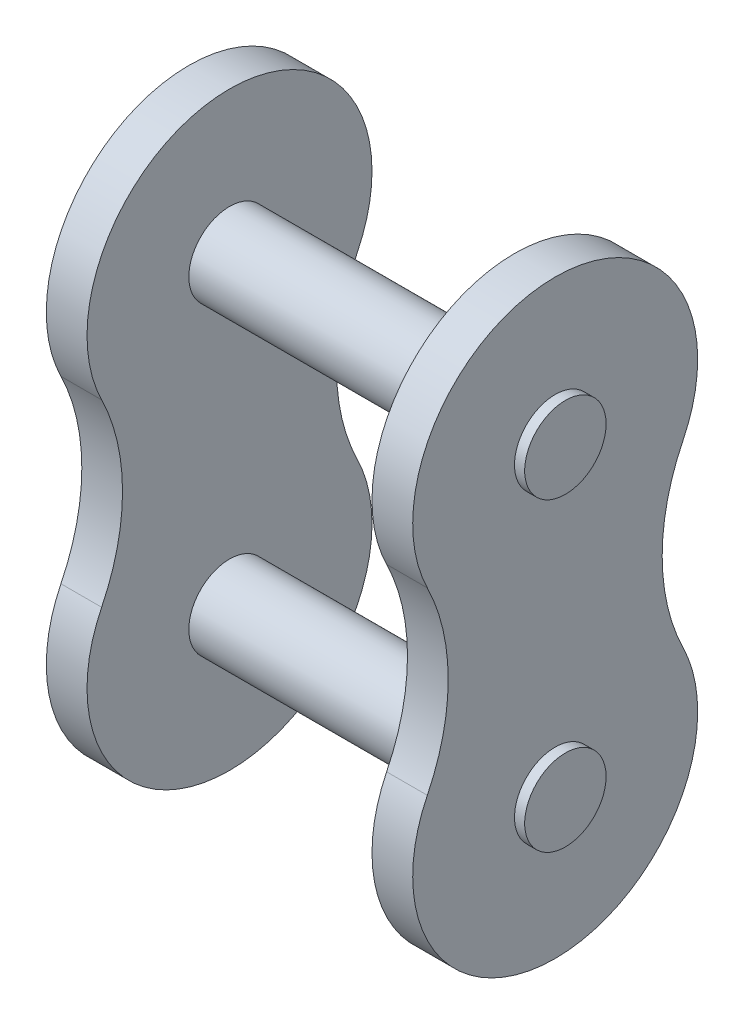
ISO-10303-21;
HEADER;
FILE_DESCRIPTION(('STEP AP214'),'2;1');
FILE_NAME('part.step','',(''),(''),'','','');
FILE_SCHEMA(('AUTOMOTIVE_DESIGN { 1 0 10303 214 1 1 1 1 }'));
ENDSEC;
DATA;
#1=APPLICATION_CONTEXT('core data for automotive mechanical design processes');
#2=APPLICATION_PROTOCOL_DEFINITION('international standard','automotive_design',2000,#1);
#3=PRODUCT_CONTEXT('',#1,'mechanical');
#4=PRODUCT('Part','Part','',(#3));
#5=PRODUCT_RELATED_PRODUCT_CATEGORY('part','',(#4));
#6=PRODUCT_DEFINITION_FORMATION('','',#4);
#7=PRODUCT_DEFINITION_CONTEXT('part definition',#1,'design');
#8=PRODUCT_DEFINITION('design','',#6,#7);
#9=PRODUCT_DEFINITION_SHAPE('','',#8);
#10=(LENGTH_UNIT() NAMED_UNIT(*) SI_UNIT(.MILLI.,.METRE.));
#11=(NAMED_UNIT(*) PLANE_ANGLE_UNIT() SI_UNIT($,.RADIAN.));
#12=(NAMED_UNIT(*) SI_UNIT($,.STERADIAN.) SOLID_ANGLE_UNIT());
#13=UNCERTAINTY_MEASURE_WITH_UNIT(LENGTH_MEASURE(1.E-05),#10,'distance_accuracy_value','');
#14=(GEOMETRIC_REPRESENTATION_CONTEXT(3) GLOBAL_UNCERTAINTY_ASSIGNED_CONTEXT((#13)) GLOBAL_UNIT_ASSIGNED_CONTEXT((#10,
#11,#12)) REPRESENTATION_CONTEXT('',''));
#15=CARTESIAN_POINT('',(0.,0.,0.));
#16=DIRECTION('',(0.,0.,1.));
#17=DIRECTION('',(1.,0.,0.));
#18=AXIS2_PLACEMENT_3D('',#15,#16,#17);
#19=CARTESIAN_POINT('',(-1.,3.75,0.));
#20=DIRECTION('',(1.,0.,0.));
#21=DIRECTION('',(0.,0.,-1.));
#22=AXIS2_PLACEMENT_3D('',#19,#20,#21);
#23=CYLINDRICAL_SURFACE('',#22,3.5);
#24=CARTESIAN_POINT('',(0.,3.75,0.));
#25=DIRECTION('',(1.,0.,0.));
#26=DIRECTION('',(0.,0.,-1.));
#27=AXIS2_PLACEMENT_3D('',#24,#25,#26);
#28=CIRCLE('',#27,3.5);
#29=CARTESIAN_POINT('',(0.,2.20588235294118,3.14097129755137));
#30=VERTEX_POINT('',#29);
#31=CARTESIAN_POINT('',(0.,2.20588235294118,-3.14097129755137));
#32=VERTEX_POINT('',#31);
#33=EDGE_CURVE('E204',#30,#32,#28,.F.);
#34=ORIENTED_EDGE('',*,*,#33,.T.);
#35=DIRECTION('',(1.,0.,0.));
#36=VECTOR('',#35,1.);
#37=CARTESIAN_POINT('',(-1.,2.20588235294118,-3.14097129755137));
#38=LINE('',#37,#36);
#39=CARTESIAN_POINT('',(-1.,2.20588235294118,-3.14097129755137));
#40=VERTEX_POINT('',#39);
#41=EDGE_CURVE('E12',#40,#32,#38,.T.);
#42=ORIENTED_EDGE('',*,*,#41,.F.);
#43=CARTESIAN_POINT('',(-1.,3.75,0.));
#44=DIRECTION('',(1.,0.,0.));
#45=DIRECTION('',(0.,0.,-1.));
#46=AXIS2_PLACEMENT_3D('',#43,#44,#45);
#47=CIRCLE('',#46,3.5);
#48=CARTESIAN_POINT('',(-1.,2.20588235294118,3.14097129755137));
#49=VERTEX_POINT('',#48);
#50=EDGE_CURVE('E85',#49,#40,#47,.F.);
#51=ORIENTED_EDGE('',*,*,#50,.F.);
#52=DIRECTION('',(1.,0.,0.));
#53=VECTOR('',#52,1.);
#54=CARTESIAN_POINT('',(-1.,2.20588235294118,3.14097129755137));
#55=LINE('',#54,#53);
#56=EDGE_CURVE('E201',#49,#30,#55,.T.);
#57=ORIENTED_EDGE('',*,*,#56,.T.);
#58=EDGE_LOOP('',(#34,#42,#51,#57));
#59=FACE_BOUND('',#58,.T.);
#60=ADVANCED_FACE('F63',(#59),#23,.T.);
#61=CARTESIAN_POINT('',(-1.,0.,-7.62807315119618));
#62=DIRECTION('',(1.,0.,0.));
#63=DIRECTION('',(0.,0.,-1.));
#64=AXIS2_PLACEMENT_3D('',#61,#62,#63);
#65=CYLINDRICAL_SURFACE('',#64,5.);
#66=CARTESIAN_POINT('',(0.,0.,-7.62807315119618));
#67=DIRECTION('',(1.,0.,0.));
#68=DIRECTION('',(0.,0.,-1.));
#69=AXIS2_PLACEMENT_3D('',#66,#67,#68);
#70=CIRCLE('',#69,5.);
#71=CARTESIAN_POINT('',(0.,-2.20588235294118,-3.14097129755137));
#72=VERTEX_POINT('',#71);
#73=EDGE_CURVE('E198',#72,#32,#70,.F.);
#74=ORIENTED_EDGE('',*,*,#73,.F.);
#75=DIRECTION('',(1.,0.,0.));
#76=VECTOR('',#75,1.);
#77=CARTESIAN_POINT('',(-1.,-2.20588235294118,-3.14097129755137));
#78=LINE('',#77,#76);
#79=CARTESIAN_POINT('',(-1.,-2.20588235294118,-3.14097129755137));
#80=VERTEX_POINT('',#79);
#81=EDGE_CURVE('E74',#80,#72,#78,.T.);
#82=ORIENTED_EDGE('',*,*,#81,.F.);
#83=CARTESIAN_POINT('',(-1.,0.,-7.62807315119618));
#84=DIRECTION('',(1.,0.,0.));
#85=DIRECTION('',(0.,0.,-1.));
#86=AXIS2_PLACEMENT_3D('',#83,#84,#85);
#87=CIRCLE('',#86,5.);
#88=EDGE_CURVE('E196',#80,#40,#87,.F.);
#89=ORIENTED_EDGE('',*,*,#88,.T.);
#90=ORIENTED_EDGE('',*,*,#41,.T.);
#91=EDGE_LOOP('',(#74,#82,#89,#90));
#92=FACE_BOUND('',#91,.T.);
#93=ADVANCED_FACE('F225',(#92),#65,.F.);
#94=CARTESIAN_POINT('',(-1.,0.,7.62807315119618));
#95=DIRECTION('',(1.,0.,0.));
#96=DIRECTION('',(0.,0.,-1.));
#97=AXIS2_PLACEMENT_3D('',#94,#95,#96);
#98=CYLINDRICAL_SURFACE('',#97,5.);
#99=CARTESIAN_POINT('',(0.,0.,7.62807315119618));
#100=DIRECTION('',(1.,0.,0.));
#101=DIRECTION('',(0.,0.,-1.));
#102=AXIS2_PLACEMENT_3D('',#99,#100,#101);
#103=CIRCLE('',#102,5.);
#104=CARTESIAN_POINT('',(0.,-2.20588235294118,3.14097129755137));
#105=VERTEX_POINT('',#104);
#106=EDGE_CURVE('E206',#105,#30,#103,.T.);
#107=ORIENTED_EDGE('',*,*,#106,.T.);
#108=ORIENTED_EDGE('',*,*,#56,.F.);
#109=CARTESIAN_POINT('',(-1.,0.,7.62807315119618));
#110=DIRECTION('',(1.,0.,0.));
#111=DIRECTION('',(0.,0.,-1.));
#112=AXIS2_PLACEMENT_3D('',#109,#110,#111);
#113=CIRCLE('',#112,5.);
#114=CARTESIAN_POINT('',(-1.,-2.20588235294118,3.14097129755137));
#115=VERTEX_POINT('',#114);
#116=EDGE_CURVE('E109',#115,#49,#113,.T.);
#117=ORIENTED_EDGE('',*,*,#116,.F.);
#118=DIRECTION('',(1.,0.,0.));
#119=VECTOR('',#118,1.);
#120=CARTESIAN_POINT('',(-1.,-2.20588235294118,3.14097129755137));
#121=LINE('',#120,#119);
#122=EDGE_CURVE('E215',#115,#105,#121,.T.);
#123=ORIENTED_EDGE('',*,*,#122,.T.);
#124=EDGE_LOOP('',(#107,#108,#117,#123));
#125=FACE_BOUND('',#124,.T.);
#126=ADVANCED_FACE('F226',(#125),#98,.F.);
#127=CARTESIAN_POINT('',(-1.,0.,0.));
#128=DIRECTION('',(1.,0.,0.));
#129=DIRECTION('',(0.,0.,-1.));
#130=AXIS2_PLACEMENT_3D('',#127,#128,#129);
#131=PLANE('',#130);
#132=ORIENTED_EDGE('',*,*,#50,.T.);
#133=ORIENTED_EDGE('',*,*,#88,.F.);
#134=CARTESIAN_POINT('',(-1.,-3.75,0.));
#135=DIRECTION('',(1.,0.,0.));
#136=DIRECTION('',(0.,0.,-1.));
#137=AXIS2_PLACEMENT_3D('',#134,#135,#136);
#138=CIRCLE('',#137,3.5);
#139=EDGE_CURVE('E210',#115,#80,#138,.T.);
#140=ORIENTED_EDGE('',*,*,#139,.F.);
#141=ORIENTED_EDGE('',*,*,#116,.T.);
#142=EDGE_LOOP('',(#132,#133,#140,#141));
#143=FACE_BOUND('',#142,.T.);
#144=CARTESIAN_POINT('',(-1.,3.75,0.));
#145=DIRECTION('',(1.,0.,0.));
#146=DIRECTION('',(0.,0.,-1.));
#147=AXIS2_PLACEMENT_3D('',#144,#145,#146);
#148=CIRCLE('',#147,1.);
#149=CARTESIAN_POINT('',(-1.,3.75,-1.));
#150=VERTEX_POINT('',#149);
#151=EDGE_CURVE('E199',#150,#150,#148,.F.);
#152=ORIENTED_EDGE('',*,*,#151,.F.);
#153=EDGE_LOOP('',(#152));
#154=FACE_BOUND('',#153,.T.);
#155=CARTESIAN_POINT('',(-1.,-3.75,0.));
#156=DIRECTION('',(1.,0.,0.));
#157=DIRECTION('',(0.,0.,-1.));
#158=AXIS2_PLACEMENT_3D('',#155,#156,#157);
#159=CIRCLE('',#158,1.);
#160=CARTESIAN_POINT('',(-1.,-3.75,-1.));
#161=VERTEX_POINT('',#160);
#162=EDGE_CURVE('E194',#161,#161,#159,.T.);
#163=ORIENTED_EDGE('',*,*,#162,.T.);
#164=EDGE_LOOP('',(#163));
#165=FACE_BOUND('',#164,.T.);
#166=ADVANCED_FACE('F224',(#143,#154,#165),#131,.F.);
#167=CARTESIAN_POINT('',(0.,0.,0.));
#168=DIRECTION('',(1.,0.,0.));
#169=DIRECTION('',(0.,0.,-1.));
#170=AXIS2_PLACEMENT_3D('',#167,#168,#169);
#171=PLANE('',#170);
#172=ORIENTED_EDGE('',*,*,#33,.F.);
#173=ORIENTED_EDGE('',*,*,#106,.F.);
#174=CARTESIAN_POINT('',(0.,-3.75,0.));
#175=DIRECTION('',(1.,0.,0.));
#176=DIRECTION('',(0.,0.,-1.));
#177=AXIS2_PLACEMENT_3D('',#174,#175,#176);
#178=CIRCLE('',#177,3.5);
#179=EDGE_CURVE('E70',#105,#72,#178,.T.);
#180=ORIENTED_EDGE('',*,*,#179,.T.);
#181=ORIENTED_EDGE('',*,*,#73,.T.);
#182=EDGE_LOOP('',(#172,#173,#180,#181));
#183=FACE_BOUND('',#182,.T.);
#184=CARTESIAN_POINT('',(0.,3.75,0.));
#185=DIRECTION('',(1.,0.,0.));
#186=DIRECTION('',(0.,0.,-1.));
#187=AXIS2_PLACEMENT_3D('',#184,#185,#186);
#188=CIRCLE('',#187,1.);
#189=CARTESIAN_POINT('',(0.,3.75,-1.));
#190=VERTEX_POINT('',#189);
#191=EDGE_CURVE('E184',#190,#190,#188,.F.);
#192=ORIENTED_EDGE('',*,*,#191,.T.);
#193=EDGE_LOOP('',(#192));
#194=FACE_BOUND('',#193,.T.);
#195=CARTESIAN_POINT('',(0.,-3.75,0.));
#196=DIRECTION('',(1.,0.,0.));
#197=DIRECTION('',(0.,0.,-1.));
#198=AXIS2_PLACEMENT_3D('',#195,#196,#197);
#199=CIRCLE('',#198,1.);
#200=CARTESIAN_POINT('',(0.,-3.75,-1.));
#201=VERTEX_POINT('',#200);
#202=EDGE_CURVE('E193',#201,#201,#199,.T.);
#203=ORIENTED_EDGE('',*,*,#202,.F.);
#204=EDGE_LOOP('',(#203));
#205=FACE_BOUND('',#204,.T.);
#206=ADVANCED_FACE('F219',(#183,#194,#205),#171,.T.);
#207=CARTESIAN_POINT('',(-1.,-3.75,0.));
#208=DIRECTION('',(1.,0.,0.));
#209=DIRECTION('',(0.,0.,-1.));
#210=AXIS2_PLACEMENT_3D('',#207,#208,#209);
#211=CYLINDRICAL_SURFACE('',#210,3.5);
#212=ORIENTED_EDGE('',*,*,#139,.T.);
#213=ORIENTED_EDGE('',*,*,#81,.T.);
#214=ORIENTED_EDGE('',*,*,#179,.F.);
#215=ORIENTED_EDGE('',*,*,#122,.F.);
#216=EDGE_LOOP('',(#212,#213,#214,#215));
#217=FACE_BOUND('',#216,.T.);
#218=ADVANCED_FACE('F69',(#217),#211,.T.);
#219=CARTESIAN_POINT('',(-1.25,3.75,0.));
#220=DIRECTION('',(1.,0.,0.));
#221=DIRECTION('',(0.,0.,-1.));
#222=AXIS2_PLACEMENT_3D('',#219,#220,#221);
#223=CYLINDRICAL_SURFACE('',#222,1.);
#224=ORIENTED_EDGE('',*,*,#191,.F.);
#225=EDGE_LOOP('',(#224));
#226=FACE_BOUND('',#225,.T.);
#227=CARTESIAN_POINT('',(7.,3.75,0.));
#228=DIRECTION('',(1.,0.,0.));
#229=DIRECTION('',(0.,0.,-1.));
#230=AXIS2_PLACEMENT_3D('',#227,#228,#229);
#231=CIRCLE('',#230,1.);
#232=CARTESIAN_POINT('',(7.,3.75,-1.));
#233=VERTEX_POINT('',#232);
#234=EDGE_CURVE('E473',#233,#233,#231,.F.);
#235=ORIENTED_EDGE('',*,*,#234,.T.);
#236=EDGE_LOOP('',(#235));
#237=FACE_BOUND('',#236,.T.);
#238=ADVANCED_FACE('F237',(#226,#237),#223,.T.);
#239=CARTESIAN_POINT('',(-1.25,-3.75,0.));
#240=DIRECTION('',(1.,0.,0.));
#241=DIRECTION('',(0.,0.,-1.));
#242=AXIS2_PLACEMENT_3D('',#239,#240,#241);
#243=CYLINDRICAL_SURFACE('',#242,1.);
#244=ORIENTED_EDGE('',*,*,#202,.T.);
#245=EDGE_LOOP('',(#244));
#246=FACE_BOUND('',#245,.T.);
#247=CARTESIAN_POINT('',(7.,-3.75,0.));
#248=DIRECTION('',(1.,0.,0.));
#249=DIRECTION('',(0.,0.,-1.));
#250=AXIS2_PLACEMENT_3D('',#247,#248,#249);
#251=CIRCLE('',#250,1.);
#252=CARTESIAN_POINT('',(7.,-3.75,-1.));
#253=VERTEX_POINT('',#252);
#254=EDGE_CURVE('E174',#253,#253,#251,.T.);
#255=ORIENTED_EDGE('',*,*,#254,.F.);
#256=EDGE_LOOP('',(#255));
#257=FACE_BOUND('',#256,.T.);
#258=ADVANCED_FACE('F241',(#246,#257),#243,.T.);
#259=CARTESIAN_POINT('',(-1.25,3.75,0.));
#260=DIRECTION('',(1.,0.,0.));
#261=DIRECTION('',(0.,0.,-1.));
#262=AXIS2_PLACEMENT_3D('',#259,#260,#261);
#263=CIRCLE('',#262,1.);
#264=CARTESIAN_POINT('',(-1.25,3.75,-1.));
#265=VERTEX_POINT('',#264);
#266=EDGE_CURVE('E183',#265,#265,#263,.F.);
#267=ORIENTED_EDGE('',*,*,#266,.F.);
#268=EDGE_LOOP('',(#267));
#269=FACE_BOUND('',#268,.T.);
#270=ORIENTED_EDGE('',*,*,#151,.T.);
#271=EDGE_LOOP('',(#270));
#272=FACE_BOUND('',#271,.T.);
#273=ADVANCED_FACE('F243',(#269,#272),#223,.T.);
#274=CARTESIAN_POINT('',(-1.25,0.,0.));
#275=DIRECTION('',(1.,0.,0.));
#276=DIRECTION('',(0.,0.,-1.));
#277=AXIS2_PLACEMENT_3D('',#274,#275,#276);
#278=PLANE('',#277);
#279=ORIENTED_EDGE('',*,*,#266,.T.);
#280=EDGE_LOOP('',(#279));
#281=FACE_BOUND('',#280,.T.);
#282=ADVANCED_FACE('F277',(#281),#278,.F.);
#283=CARTESIAN_POINT('',(-1.25,-3.75,0.));
#284=DIRECTION('',(1.,0.,0.));
#285=DIRECTION('',(0.,0.,-1.));
#286=AXIS2_PLACEMENT_3D('',#283,#284,#285);
#287=CIRCLE('',#286,1.);
#288=CARTESIAN_POINT('',(-1.25,-3.75,-1.));
#289=VERTEX_POINT('',#288);
#290=EDGE_CURVE('E182',#289,#289,#287,.T.);
#291=ORIENTED_EDGE('',*,*,#290,.T.);
#292=EDGE_LOOP('',(#291));
#293=FACE_BOUND('',#292,.T.);
#294=ORIENTED_EDGE('',*,*,#162,.F.);
#295=EDGE_LOOP('',(#294));
#296=FACE_BOUND('',#295,.T.);
#297=ADVANCED_FACE('F276',(#293,#296),#243,.T.);
#298=CARTESIAN_POINT('',(-1.25,0.,0.));
#299=DIRECTION('',(1.,0.,0.));
#300=DIRECTION('',(0.,0.,-1.));
#301=AXIS2_PLACEMENT_3D('',#298,#299,#300);
#302=PLANE('',#301);
#303=ORIENTED_EDGE('',*,*,#290,.F.);
#304=EDGE_LOOP('',(#303));
#305=FACE_BOUND('',#304,.T.);
#306=ADVANCED_FACE('F285',(#305),#302,.F.);
#307=CARTESIAN_POINT('',(8.,3.75,0.));
#308=DIRECTION('',(-1.,0.,0.));
#309=DIRECTION('',(0.,0.,-1.));
#310=AXIS2_PLACEMENT_3D('',#307,#308,#309);
#311=CYLINDRICAL_SURFACE('',#310,3.5);
#312=CARTESIAN_POINT('',(7.,3.75,0.));
#313=DIRECTION('',(1.,0.,0.));
#314=DIRECTION('',(0.,0.,-1.));
#315=AXIS2_PLACEMENT_3D('',#312,#313,#314);
#316=CIRCLE('',#315,3.5);
#317=CARTESIAN_POINT('',(7.,2.20588235294118,3.14097129755137));
#318=VERTEX_POINT('',#317);
#319=CARTESIAN_POINT('',(7.,2.20588235294118,-3.14097129755137));
#320=VERTEX_POINT('',#319);
#321=EDGE_CURVE('E163',#318,#320,#316,.F.);
#322=ORIENTED_EDGE('',*,*,#321,.F.);
#323=DIRECTION('',(-1.,0.,0.));
#324=VECTOR('',#323,1.);
#325=CARTESIAN_POINT('',(8.,2.20588235294118,3.14097129755137));
#326=LINE('',#325,#324);
#327=CARTESIAN_POINT('',(8.,2.20588235294118,3.14097129755137));
#328=VERTEX_POINT('',#327);
#329=EDGE_CURVE('E144',#328,#318,#326,.T.);
#330=ORIENTED_EDGE('',*,*,#329,.F.);
#331=CARTESIAN_POINT('',(8.,3.75,0.));
#332=DIRECTION('',(1.,0.,0.));
#333=DIRECTION('',(0.,0.,-1.));
#334=AXIS2_PLACEMENT_3D('',#331,#332,#333);
#335=CIRCLE('',#334,3.5);
#336=CARTESIAN_POINT('',(8.,2.20588235294118,-3.14097129755137));
#337=VERTEX_POINT('',#336);
#338=EDGE_CURVE('E151',#328,#337,#335,.F.);
#339=ORIENTED_EDGE('',*,*,#338,.T.);
#340=DIRECTION('',(-1.,0.,0.));
#341=VECTOR('',#340,1.);
#342=CARTESIAN_POINT('',(8.,2.20588235294118,-3.14097129755137));
#343=LINE('',#342,#341);
#344=EDGE_CURVE('E189',#337,#320,#343,.T.);
#345=ORIENTED_EDGE('',*,*,#344,.T.);
#346=EDGE_LOOP('',(#322,#330,#339,#345));
#347=FACE_BOUND('',#346,.T.);
#348=ADVANCED_FACE('F165',(#347),#311,.T.);
#349=CARTESIAN_POINT('',(8.,0.,-7.62807315119618));
#350=DIRECTION('',(-1.,0.,0.));
#351=DIRECTION('',(0.,0.,-1.));
#352=AXIS2_PLACEMENT_3D('',#349,#350,#351);
#353=CYLINDRICAL_SURFACE('',#352,5.);
#354=CARTESIAN_POINT('',(7.,0.,-7.62807315119618));
#355=DIRECTION('',(1.,0.,0.));
#356=DIRECTION('',(0.,0.,-1.));
#357=AXIS2_PLACEMENT_3D('',#354,#355,#356);
#358=CIRCLE('',#357,5.);
#359=CARTESIAN_POINT('',(7.,-2.20588235294118,-3.14097129755137));
#360=VERTEX_POINT('',#359);
#361=EDGE_CURVE('E159',#360,#320,#358,.F.);
#362=ORIENTED_EDGE('',*,*,#361,.T.);
#363=ORIENTED_EDGE('',*,*,#344,.F.);
#364=CARTESIAN_POINT('',(8.,0.,-7.62807315119618));
#365=DIRECTION('',(1.,0.,0.));
#366=DIRECTION('',(0.,0.,-1.));
#367=AXIS2_PLACEMENT_3D('',#364,#365,#366);
#368=CIRCLE('',#367,5.);
#369=CARTESIAN_POINT('',(8.,-2.20588235294118,-3.14097129755137));
#370=VERTEX_POINT('',#369);
#371=EDGE_CURVE('E147',#370,#337,#368,.F.);
#372=ORIENTED_EDGE('',*,*,#371,.F.);
#373=DIRECTION('',(-1.,0.,0.));
#374=VECTOR('',#373,1.);
#375=CARTESIAN_POINT('',(8.,-2.20588235294118,-3.14097129755137));
#376=LINE('',#375,#374);
#377=EDGE_CURVE('E170',#370,#360,#376,.T.);
#378=ORIENTED_EDGE('',*,*,#377,.T.);
#379=EDGE_LOOP('',(#362,#363,#372,#378));
#380=FACE_BOUND('',#379,.T.);
#381=ADVANCED_FACE('F297',(#380),#353,.F.);
#382=CARTESIAN_POINT('',(8.,0.,7.62807315119618));
#383=DIRECTION('',(-1.,0.,0.));
#384=DIRECTION('',(0.,0.,-1.));
#385=AXIS2_PLACEMENT_3D('',#382,#383,#384);
#386=CYLINDRICAL_SURFACE('',#385,5.);
#387=CARTESIAN_POINT('',(7.,0.,7.62807315119618));
#388=DIRECTION('',(1.,0.,0.));
#389=DIRECTION('',(0.,0.,-1.));
#390=AXIS2_PLACEMENT_3D('',#387,#388,#389);
#391=CIRCLE('',#390,5.);
#392=CARTESIAN_POINT('',(7.,-2.20588235294118,3.14097129755137));
#393=VERTEX_POINT('',#392);
#394=EDGE_CURVE('E483',#393,#318,#391,.T.);
#395=ORIENTED_EDGE('',*,*,#394,.F.);
#396=DIRECTION('',(-1.,0.,0.));
#397=VECTOR('',#396,1.);
#398=CARTESIAN_POINT('',(8.,-2.20588235294118,3.14097129755137));
#399=LINE('',#398,#397);
#400=CARTESIAN_POINT('',(8.,-2.20588235294118,3.14097129755137));
#401=VERTEX_POINT('',#400);
#402=EDGE_CURVE('E146',#401,#393,#399,.T.);
#403=ORIENTED_EDGE('',*,*,#402,.F.);
#404=CARTESIAN_POINT('',(8.,0.,7.62807315119618));
#405=DIRECTION('',(1.,0.,0.));
#406=DIRECTION('',(0.,0.,-1.));
#407=AXIS2_PLACEMENT_3D('',#404,#405,#406);
#408=CIRCLE('',#407,5.);
#409=EDGE_CURVE('E137',#401,#328,#408,.T.);
#410=ORIENTED_EDGE('',*,*,#409,.T.);
#411=ORIENTED_EDGE('',*,*,#329,.T.);
#412=EDGE_LOOP('',(#395,#403,#410,#411));
#413=FACE_BOUND('',#412,.T.);
#414=ADVANCED_FACE('F141',(#413),#386,.F.);
#415=CARTESIAN_POINT('',(8.,0.,0.));
#416=DIRECTION('',(-1.,0.,0.));
#417=DIRECTION('',(0.,0.,-1.));
#418=AXIS2_PLACEMENT_3D('',#415,#416,#417);
#419=PLANE('',#418);
#420=ORIENTED_EDGE('',*,*,#338,.F.);
#421=ORIENTED_EDGE('',*,*,#409,.F.);
#422=CARTESIAN_POINT('',(8.,-3.75,0.));
#423=DIRECTION('',(1.,0.,0.));
#424=DIRECTION('',(0.,0.,-1.));
#425=AXIS2_PLACEMENT_3D('',#422,#423,#424);
#426=CIRCLE('',#425,3.5);
#427=EDGE_CURVE('E180',#401,#370,#426,.T.);
#428=ORIENTED_EDGE('',*,*,#427,.T.);
#429=ORIENTED_EDGE('',*,*,#371,.T.);
#430=EDGE_LOOP('',(#420,#421,#428,#429));
#431=FACE_BOUND('',#430,.T.);
#432=CARTESIAN_POINT('',(8.,3.75,0.));
#433=DIRECTION('',(1.,0.,0.));
#434=DIRECTION('',(0.,0.,-1.));
#435=AXIS2_PLACEMENT_3D('',#432,#433,#434);
#436=CIRCLE('',#435,1.);
#437=CARTESIAN_POINT('',(8.,3.75,-1.));
#438=VERTEX_POINT('',#437);
#439=EDGE_CURVE('E164',#438,#438,#436,.F.);
#440=ORIENTED_EDGE('',*,*,#439,.T.);
#441=EDGE_LOOP('',(#440));
#442=FACE_BOUND('',#441,.T.);
#443=CARTESIAN_POINT('',(8.,-3.75,0.));
#444=DIRECTION('',(1.,0.,0.));
#445=DIRECTION('',(0.,0.,-1.));
#446=AXIS2_PLACEMENT_3D('',#443,#444,#445);
#447=CIRCLE('',#446,1.);
#448=CARTESIAN_POINT('',(8.,-3.75,-1.));
#449=VERTEX_POINT('',#448);
#450=EDGE_CURVE('E176',#449,#449,#447,.T.);
#451=ORIENTED_EDGE('',*,*,#450,.F.);
#452=EDGE_LOOP('',(#451));
#453=FACE_BOUND('',#452,.T.);
#454=ADVANCED_FACE('F152',(#431,#442,#453),#419,.F.);
#455=CARTESIAN_POINT('',(7.,0.,0.));
#456=DIRECTION('',(-1.,0.,0.));
#457=DIRECTION('',(0.,0.,-1.));
#458=AXIS2_PLACEMENT_3D('',#455,#456,#457);
#459=PLANE('',#458);
#460=ORIENTED_EDGE('',*,*,#321,.T.);
#461=ORIENTED_EDGE('',*,*,#361,.F.);
#462=CARTESIAN_POINT('',(7.,-3.75,0.));
#463=DIRECTION('',(1.,0.,0.));
#464=DIRECTION('',(0.,0.,-1.));
#465=AXIS2_PLACEMENT_3D('',#462,#463,#464);
#466=CIRCLE('',#465,3.5);
#467=EDGE_CURVE('E179',#393,#360,#466,.T.);
#468=ORIENTED_EDGE('',*,*,#467,.F.);
#469=ORIENTED_EDGE('',*,*,#394,.T.);
#470=EDGE_LOOP('',(#460,#461,#468,#469));
#471=FACE_BOUND('',#470,.T.);
#472=ORIENTED_EDGE('',*,*,#234,.F.);
#473=EDGE_LOOP('',(#472));
#474=FACE_BOUND('',#473,.T.);
#475=ORIENTED_EDGE('',*,*,#254,.T.);
#476=EDGE_LOOP('',(#475));
#477=FACE_BOUND('',#476,.T.);
#478=ADVANCED_FACE('F319',(#471,#474,#477),#459,.T.);
#479=CARTESIAN_POINT('',(8.,-3.75,0.));
#480=DIRECTION('',(-1.,0.,0.));
#481=DIRECTION('',(0.,0.,-1.));
#482=AXIS2_PLACEMENT_3D('',#479,#480,#481);
#483=CYLINDRICAL_SURFACE('',#482,3.5);
#484=ORIENTED_EDGE('',*,*,#427,.F.);
#485=ORIENTED_EDGE('',*,*,#402,.T.);
#486=ORIENTED_EDGE('',*,*,#467,.T.);
#487=ORIENTED_EDGE('',*,*,#377,.F.);
#488=EDGE_LOOP('',(#484,#485,#486,#487));
#489=FACE_BOUND('',#488,.T.);
#490=ADVANCED_FACE('F328',(#489),#483,.T.);
#491=CARTESIAN_POINT('',(8.25,3.75,0.));
#492=DIRECTION('',(-1.,0.,0.));
#493=DIRECTION('',(0.,0.,-1.));
#494=AXIS2_PLACEMENT_3D('',#491,#492,#493);
#495=CYLINDRICAL_SURFACE('',#494,1.);
#496=CARTESIAN_POINT('',(8.25,3.75,0.));
#497=DIRECTION('',(1.,0.,0.));
#498=DIRECTION('',(0.,0.,-1.));
#499=AXIS2_PLACEMENT_3D('',#496,#497,#498);
#500=CIRCLE('',#499,1.);
#501=CARTESIAN_POINT('',(8.25,3.75,-1.));
#502=VERTEX_POINT('',#501);
#503=EDGE_CURVE('E472',#502,#502,#500,.F.);
#504=ORIENTED_EDGE('',*,*,#503,.T.);
#505=EDGE_LOOP('',(#504));
#506=FACE_BOUND('',#505,.T.);
#507=ORIENTED_EDGE('',*,*,#439,.F.);
#508=EDGE_LOOP('',(#507));
#509=FACE_BOUND('',#508,.T.);
#510=ADVANCED_FACE('F340',(#506,#509),#495,.T.);
#511=CARTESIAN_POINT('',(8.25,0.,0.));
#512=DIRECTION('',(-1.,0.,0.));
#513=DIRECTION('',(0.,0.,-1.));
#514=AXIS2_PLACEMENT_3D('',#511,#512,#513);
#515=PLANE('',#514);
#516=ORIENTED_EDGE('',*,*,#503,.F.);
#517=EDGE_LOOP('',(#516));
#518=FACE_BOUND('',#517,.T.);
#519=ADVANCED_FACE('F348',(#518),#515,.F.);
#520=CARTESIAN_POINT('',(8.25,-3.75,0.));
#521=DIRECTION('',(-1.,0.,0.));
#522=DIRECTION('',(0.,0.,-1.));
#523=AXIS2_PLACEMENT_3D('',#520,#521,#522);
#524=CYLINDRICAL_SURFACE('',#523,1.);
#525=CARTESIAN_POINT('',(8.25,-3.75,0.));
#526=DIRECTION('',(1.,0.,0.));
#527=DIRECTION('',(0.,0.,-1.));
#528=AXIS2_PLACEMENT_3D('',#525,#526,#527);
#529=CIRCLE('',#528,1.);
#530=CARTESIAN_POINT('',(8.25,-3.75,-1.));
#531=VERTEX_POINT('',#530);
#532=EDGE_CURVE('E467',#531,#531,#529,.T.);
#533=ORIENTED_EDGE('',*,*,#532,.F.);
#534=EDGE_LOOP('',(#533));
#535=FACE_BOUND('',#534,.T.);
#536=ORIENTED_EDGE('',*,*,#450,.T.);
#537=EDGE_LOOP('',(#536));
#538=FACE_BOUND('',#537,.T.);
#539=ADVANCED_FACE('F358',(#535,#538),#524,.T.);
#540=CARTESIAN_POINT('',(8.25,0.,0.));
#541=DIRECTION('',(-1.,0.,0.));
#542=DIRECTION('',(0.,0.,-1.));
#543=AXIS2_PLACEMENT_3D('',#540,#541,#542);
#544=PLANE('',#543);
#545=ORIENTED_EDGE('',*,*,#532,.T.);
#546=EDGE_LOOP('',(#545));
#547=FACE_BOUND('',#546,.T.);
#548=ADVANCED_FACE('F366',(#547),#544,.F.);
#549=CLOSED_SHELL('',(#60,#93,#126,#166,#206,#218,#238,#258,#273,#282,#297,#306,#348,#381,#414,
#454,#478,#490,#510,#519,#539,#548));
#550=MANIFOLD_SOLID_BREP('B2',#549);
#551=ADVANCED_BREP_SHAPE_REPRESENTATION('',(#18,#550),#14);
#552=SHAPE_DEFINITION_REPRESENTATION(#9,#551);
ENDSEC;
END-ISO-10303-21;
